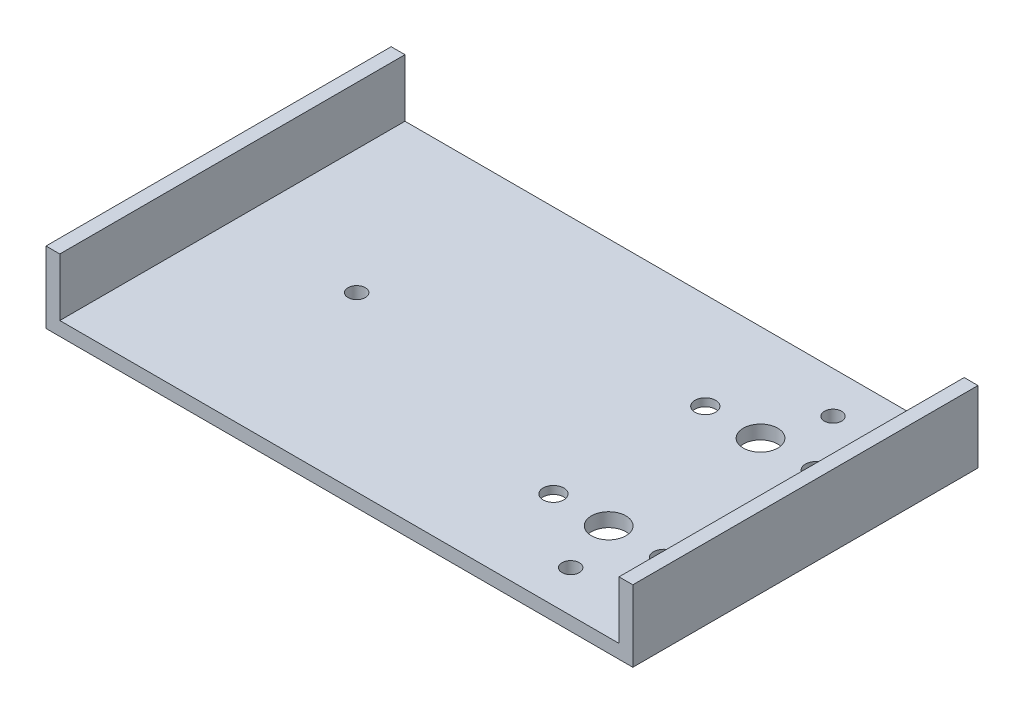
ISO-10303-21;
HEADER;
FILE_DESCRIPTION(('STEP AP214'),'2;1');
FILE_NAME('part.step','',(''),(''),'','','');
FILE_SCHEMA(('AUTOMOTIVE_DESIGN { 1 0 10303 214 1 1 1 1 }'));
ENDSEC;
DATA;
#1=APPLICATION_CONTEXT('core data for automotive mechanical design processes');
#2=APPLICATION_PROTOCOL_DEFINITION('international standard','automotive_design',2000,#1);
#3=PRODUCT_CONTEXT('',#1,'mechanical');
#4=PRODUCT('Part','Part','',(#3));
#5=PRODUCT_RELATED_PRODUCT_CATEGORY('part','',(#4));
#6=PRODUCT_DEFINITION_FORMATION('','',#4);
#7=PRODUCT_DEFINITION_CONTEXT('part definition',#1,'design');
#8=PRODUCT_DEFINITION('design','',#6,#7);
#9=PRODUCT_DEFINITION_SHAPE('','',#8);
#10=(LENGTH_UNIT() NAMED_UNIT(*) SI_UNIT(.MILLI.,.METRE.));
#11=(NAMED_UNIT(*) PLANE_ANGLE_UNIT() SI_UNIT($,.RADIAN.));
#12=(NAMED_UNIT(*) SI_UNIT($,.STERADIAN.) SOLID_ANGLE_UNIT());
#13=UNCERTAINTY_MEASURE_WITH_UNIT(LENGTH_MEASURE(1.E-05),#10,'distance_accuracy_value','');
#14=(GEOMETRIC_REPRESENTATION_CONTEXT(3) GLOBAL_UNCERTAINTY_ASSIGNED_CONTEXT((#13)) GLOBAL_UNIT_ASSIGNED_CONTEXT((#10,
#11,#12)) REPRESENTATION_CONTEXT('',''));
#15=CARTESIAN_POINT('',(0.,0.,0.));
#16=DIRECTION('',(0.,0.,1.));
#17=DIRECTION('',(1.,0.,0.));
#18=AXIS2_PLACEMENT_3D('',#15,#16,#17);
#19=CARTESIAN_POINT('',(0.,0.,100.));
#20=DIRECTION('',(1.,0.,0.));
#21=DIRECTION('',(0.,0.,-1.));
#22=AXIS2_PLACEMENT_3D('',#19,#20,#21);
#23=PLANE('',#22);
#24=DIRECTION('',(0.,-1.,0.));
#25=VECTOR('',#24,1.);
#26=CARTESIAN_POINT('',(0.,0.,0.));
#27=LINE('',#26,#25);
#28=CARTESIAN_POINT('',(0.,20.7,0.));
#29=VERTEX_POINT('',#28);
#30=CARTESIAN_POINT('',(0.,0.,0.));
#31=VERTEX_POINT('',#30);
#32=EDGE_CURVE('E133',#29,#31,#27,.T.);
#33=ORIENTED_EDGE('',*,*,#32,.T.);
#34=DIRECTION('',(0.,0.,-1.));
#35=VECTOR('',#34,1.);
#36=CARTESIAN_POINT('',(0.,0.,100.));
#37=LINE('',#36,#35);
#38=CARTESIAN_POINT('',(0.,0.,100.));
#39=VERTEX_POINT('',#38);
#40=EDGE_CURVE('E161',#39,#31,#37,.T.);
#41=ORIENTED_EDGE('',*,*,#40,.F.);
#42=DIRECTION('',(0.,-1.,0.));
#43=VECTOR('',#42,1.);
#44=CARTESIAN_POINT('',(0.,0.,100.));
#45=LINE('',#44,#43);
#46=CARTESIAN_POINT('',(0.,20.7,100.));
#47=VERTEX_POINT('',#46);
#48=EDGE_CURVE('E148',#47,#39,#45,.T.);
#49=ORIENTED_EDGE('',*,*,#48,.F.);
#50=DIRECTION('',(0.,0.,-1.));
#51=VECTOR('',#50,1.);
#52=CARTESIAN_POINT('',(0.,20.7,100.));
#53=LINE('',#52,#51);
#54=EDGE_CURVE('E129',#47,#29,#53,.T.);
#55=ORIENTED_EDGE('',*,*,#54,.T.);
#56=EDGE_LOOP('',(#33,#41,#49,#55));
#57=FACE_BOUND('',#56,.T.);
#58=ADVANCED_FACE('F35',(#57),#23,.F.);
#59=CARTESIAN_POINT('',(0.,0.,100.));
#60=DIRECTION('',(0.,1.,0.));
#61=DIRECTION('',(0.,0.,1.));
#62=AXIS2_PLACEMENT_3D('',#59,#60,#61);
#63=PLANE('',#62);
#64=CARTESIAN_POINT('',(151.,0.,28.));
#65=DIRECTION('',(0.,1.,0.));
#66=DIRECTION('',(0.,0.,1.));
#67=AXIS2_PLACEMENT_3D('',#64,#65,#66);
#68=CIRCLE('',#67,6.00000000000003);
#69=CARTESIAN_POINT('',(151.,0.,34.));
#70=VERTEX_POINT('',#69);
#71=EDGE_CURVE('E11',#70,#70,#68,.T.);
#72=ORIENTED_EDGE('',*,*,#71,.T.);
#73=EDGE_LOOP('',(#72));
#74=FACE_BOUND('',#73,.T.);
#75=CARTESIAN_POINT('',(119.,0.,28.));
#76=DIRECTION('',(0.,1.,0.));
#77=DIRECTION('',(0.,0.,1.));
#78=AXIS2_PLACEMENT_3D('',#75,#76,#77);
#79=CIRCLE('',#78,6.00000000000003);
#80=CARTESIAN_POINT('',(119.,0.,34.));
#81=VERTEX_POINT('',#80);
#82=EDGE_CURVE('E178',#81,#81,#79,.T.);
#83=ORIENTED_EDGE('',*,*,#82,.T.);
#84=EDGE_LOOP('',(#83));
#85=FACE_BOUND('',#84,.T.);
#86=CARTESIAN_POINT('',(119.,0.,72.));
#87=DIRECTION('',(0.,1.,0.));
#88=DIRECTION('',(0.,0.,1.));
#89=AXIS2_PLACEMENT_3D('',#86,#87,#88);
#90=CIRCLE('',#89,6.00000000000009);
#91=CARTESIAN_POINT('',(119.,0.,65.9999999999999));
#92=VERTEX_POINT('',#91);
#93=EDGE_CURVE('E172',#92,#92,#90,.T.);
#94=ORIENTED_EDGE('',*,*,#93,.T.);
#95=EDGE_LOOP('',(#94));
#96=FACE_BOUND('',#95,.T.);
#97=CARTESIAN_POINT('',(151.,0.,72.));
#98=DIRECTION('',(0.,1.,0.));
#99=DIRECTION('',(0.,0.,1.));
#100=AXIS2_PLACEMENT_3D('',#97,#98,#99);
#101=CIRCLE('',#100,6.00000000000001);
#102=CARTESIAN_POINT('',(151.,0.,78.));
#103=VERTEX_POINT('',#102);
#104=EDGE_CURVE('E166',#103,#103,#101,.T.);
#105=ORIENTED_EDGE('',*,*,#104,.T.);
#106=EDGE_LOOP('',(#105));
#107=FACE_BOUND('',#106,.T.);
#108=CARTESIAN_POINT('',(140.,0.,12.));
#109=DIRECTION('',(0.,-1.,0.));
#110=DIRECTION('',(0.,0.,-1.));
#111=AXIS2_PLACEMENT_3D('',#108,#109,#110);
#112=CIRCLE('',#111,2.5);
#113=CARTESIAN_POINT('',(140.,0.,9.5));
#114=VERTEX_POINT('',#113);
#115=EDGE_CURVE('E240',#114,#114,#112,.T.);
#116=ORIENTED_EDGE('',*,*,#115,.F.);
#117=EDGE_LOOP('',(#116));
#118=FACE_BOUND('',#117,.T.);
#119=CARTESIAN_POINT('',(160.,0.,12.));
#120=DIRECTION('',(0.,-1.,0.));
#121=DIRECTION('',(0.,0.,-1.));
#122=AXIS2_PLACEMENT_3D('',#119,#120,#121);
#123=CIRCLE('',#122,2.5);
#124=CARTESIAN_POINT('',(160.,0.,9.5));
#125=VERTEX_POINT('',#124);
#126=EDGE_CURVE('E244',#125,#125,#123,.T.);
#127=ORIENTED_EDGE('',*,*,#126,.F.);
#128=EDGE_LOOP('',(#127));
#129=FACE_BOUND('',#128,.T.);
#130=CARTESIAN_POINT('',(140.,0.,88.));
#131=DIRECTION('',(0.,-1.,0.));
#132=DIRECTION('',(0.,0.,-1.));
#133=AXIS2_PLACEMENT_3D('',#130,#131,#132);
#134=CIRCLE('',#133,2.5);
#135=CARTESIAN_POINT('',(140.,0.,85.5));
#136=VERTEX_POINT('',#135);
#137=EDGE_CURVE('E250',#136,#136,#134,.T.);
#138=ORIENTED_EDGE('',*,*,#137,.F.);
#139=EDGE_LOOP('',(#138));
#140=FACE_BOUND('',#139,.T.);
#141=CARTESIAN_POINT('',(160.,0.,88.));
#142=DIRECTION('',(0.,-1.,0.));
#143=DIRECTION('',(0.,0.,-1.));
#144=AXIS2_PLACEMENT_3D('',#141,#142,#143);
#145=CIRCLE('',#144,2.5);
#146=CARTESIAN_POINT('',(160.,0.,85.5));
#147=VERTEX_POINT('',#146);
#148=EDGE_CURVE('E256',#147,#147,#145,.T.);
#149=ORIENTED_EDGE('',*,*,#148,.F.);
#150=EDGE_LOOP('',(#149));
#151=FACE_BOUND('',#150,.T.);
#152=CARTESIAN_POINT('',(40.,0.,50.));
#153=DIRECTION('',(0.,-1.,0.));
#154=DIRECTION('',(0.,0.,-1.));
#155=AXIS2_PLACEMENT_3D('',#152,#153,#154);
#156=CIRCLE('',#155,2.5);
#157=CARTESIAN_POINT('',(40.,0.,47.5));
#158=VERTEX_POINT('',#157);
#159=EDGE_CURVE('E262',#158,#158,#156,.T.);
#160=ORIENTED_EDGE('',*,*,#159,.F.);
#161=EDGE_LOOP('',(#160));
#162=FACE_BOUND('',#161,.T.);
#163=CARTESIAN_POINT('',(135.,0.,28.));
#164=DIRECTION('',(0.,-1.,0.));
#165=DIRECTION('',(0.,0.,-1.));
#166=AXIS2_PLACEMENT_3D('',#163,#164,#165);
#167=CIRCLE('',#166,5.00000000000002);
#168=CARTESIAN_POINT('',(135.,0.,23.));
#169=VERTEX_POINT('',#168);
#170=EDGE_CURVE('E268',#169,#169,#167,.T.);
#171=ORIENTED_EDGE('',*,*,#170,.F.);
#172=EDGE_LOOP('',(#171));
#173=FACE_BOUND('',#172,.T.);
#174=CARTESIAN_POINT('',(135.,0.,72.));
#175=DIRECTION('',(0.,-1.,0.));
#176=DIRECTION('',(0.,0.,-1.));
#177=AXIS2_PLACEMENT_3D('',#174,#175,#176);
#178=CIRCLE('',#177,4.99999999999999);
#179=CARTESIAN_POINT('',(135.,0.,67.));
#180=VERTEX_POINT('',#179);
#181=EDGE_CURVE('E274',#180,#180,#178,.T.);
#182=ORIENTED_EDGE('',*,*,#181,.F.);
#183=EDGE_LOOP('',(#182));
#184=FACE_BOUND('',#183,.T.);
#185=DIRECTION('',(1.,0.,0.));
#186=VECTOR('',#185,1.);
#187=CARTESIAN_POINT('',(0.,0.,0.));
#188=LINE('',#187,#186);
#189=CARTESIAN_POINT('',(170.,0.,0.));
#190=VERTEX_POINT('',#189);
#191=EDGE_CURVE('E136',#31,#190,#188,.T.);
#192=ORIENTED_EDGE('',*,*,#191,.T.);
#193=DIRECTION('',(0.,0.,-1.));
#194=VECTOR('',#193,1.);
#195=CARTESIAN_POINT('',(170.,0.,100.));
#196=LINE('',#195,#194);
#197=CARTESIAN_POINT('',(170.,0.,100.));
#198=VERTEX_POINT('',#197);
#199=EDGE_CURVE('E158',#198,#190,#196,.T.);
#200=ORIENTED_EDGE('',*,*,#199,.F.);
#201=DIRECTION('',(1.,0.,0.));
#202=VECTOR('',#201,1.);
#203=CARTESIAN_POINT('',(0.,0.,100.));
#204=LINE('',#203,#202);
#205=EDGE_CURVE('E96',#39,#198,#204,.T.);
#206=ORIENTED_EDGE('',*,*,#205,.F.);
#207=ORIENTED_EDGE('',*,*,#40,.T.);
#208=EDGE_LOOP('',(#192,#200,#206,#207));
#209=FACE_BOUND('',#208,.T.);
#210=ADVANCED_FACE('F196',(#74,#85,#96,#107,#118,#129,#140,#151,#162,#173,#184,#209),#63,.F.);
#211=CARTESIAN_POINT('',(170.,0.,100.));
#212=DIRECTION('',(-1.,0.,0.));
#213=DIRECTION('',(0.,0.,1.));
#214=AXIS2_PLACEMENT_3D('',#211,#212,#213);
#215=PLANE('',#214);
#216=DIRECTION('',(0.,1.,0.));
#217=VECTOR('',#216,1.);
#218=CARTESIAN_POINT('',(170.,0.,0.));
#219=LINE('',#218,#217);
#220=CARTESIAN_POINT('',(170.,20.7,0.));
#221=VERTEX_POINT('',#220);
#222=EDGE_CURVE('E139',#190,#221,#219,.T.);
#223=ORIENTED_EDGE('',*,*,#222,.T.);
#224=DIRECTION('',(0.,0.,-1.));
#225=VECTOR('',#224,1.);
#226=CARTESIAN_POINT('',(170.,20.7,100.));
#227=LINE('',#226,#225);
#228=CARTESIAN_POINT('',(170.,20.7,100.));
#229=VERTEX_POINT('',#228);
#230=EDGE_CURVE('E155',#229,#221,#227,.T.);
#231=ORIENTED_EDGE('',*,*,#230,.F.);
#232=DIRECTION('',(0.,1.,0.));
#233=VECTOR('',#232,1.);
#234=CARTESIAN_POINT('',(170.,0.,100.));
#235=LINE('',#234,#233);
#236=EDGE_CURVE('E283',#198,#229,#235,.T.);
#237=ORIENTED_EDGE('',*,*,#236,.F.);
#238=ORIENTED_EDGE('',*,*,#199,.T.);
#239=EDGE_LOOP('',(#223,#231,#237,#238));
#240=FACE_BOUND('',#239,.T.);
#241=ADVANCED_FACE('F203',(#240),#215,.F.);
#242=CARTESIAN_POINT('',(170.,20.7,100.));
#243=DIRECTION('',(0.,-1.,0.));
#244=DIRECTION('',(0.,0.,-1.));
#245=AXIS2_PLACEMENT_3D('',#242,#243,#244);
#246=PLANE('',#245);
#247=DIRECTION('',(-1.,0.,0.));
#248=VECTOR('',#247,1.);
#249=CARTESIAN_POINT('',(170.,20.7,0.));
#250=LINE('',#249,#248);
#251=CARTESIAN_POINT('',(166.,20.7,0.));
#252=VERTEX_POINT('',#251);
#253=EDGE_CURVE('E141',#221,#252,#250,.T.);
#254=ORIENTED_EDGE('',*,*,#253,.T.);
#255=DIRECTION('',(0.,0.,-1.));
#256=VECTOR('',#255,1.);
#257=CARTESIAN_POINT('',(166.,20.7,100.));
#258=LINE('',#257,#256);
#259=CARTESIAN_POINT('',(166.,20.7,100.));
#260=VERTEX_POINT('',#259);
#261=EDGE_CURVE('E152',#260,#252,#258,.T.);
#262=ORIENTED_EDGE('',*,*,#261,.F.);
#263=DIRECTION('',(-1.,0.,0.));
#264=VECTOR('',#263,1.);
#265=CARTESIAN_POINT('',(170.,20.7,100.));
#266=LINE('',#265,#264);
#267=EDGE_CURVE('E285',#229,#260,#266,.T.);
#268=ORIENTED_EDGE('',*,*,#267,.F.);
#269=ORIENTED_EDGE('',*,*,#230,.T.);
#270=EDGE_LOOP('',(#254,#262,#268,#269));
#271=FACE_BOUND('',#270,.T.);
#272=ADVANCED_FACE('F291',(#271),#246,.F.);
#273=CARTESIAN_POINT('',(166.,4.,100.));
#274=DIRECTION('',(1.,0.,0.));
#275=DIRECTION('',(0.,0.,-1.));
#276=AXIS2_PLACEMENT_3D('',#273,#274,#275);
#277=PLANE('',#276);
#278=DIRECTION('',(0.,-1.,0.));
#279=VECTOR('',#278,1.);
#280=CARTESIAN_POINT('',(166.,4.,0.));
#281=LINE('',#280,#279);
#282=CARTESIAN_POINT('',(166.,4.,0.));
#283=VERTEX_POINT('',#282);
#284=EDGE_CURVE('E143',#252,#283,#281,.T.);
#285=ORIENTED_EDGE('',*,*,#284,.T.);
#286=DIRECTION('',(0.,0.,-1.));
#287=VECTOR('',#286,1.);
#288=CARTESIAN_POINT('',(166.,4.,100.));
#289=LINE('',#288,#287);
#290=CARTESIAN_POINT('',(166.,4.,100.));
#291=VERTEX_POINT('',#290);
#292=EDGE_CURVE('E124',#291,#283,#289,.T.);
#293=ORIENTED_EDGE('',*,*,#292,.F.);
#294=DIRECTION('',(0.,-1.,0.));
#295=VECTOR('',#294,1.);
#296=CARTESIAN_POINT('',(166.,4.,100.));
#297=LINE('',#296,#295);
#298=EDGE_CURVE('E115',#260,#291,#297,.T.);
#299=ORIENTED_EDGE('',*,*,#298,.F.);
#300=ORIENTED_EDGE('',*,*,#261,.T.);
#301=EDGE_LOOP('',(#285,#293,#299,#300));
#302=FACE_BOUND('',#301,.T.);
#303=ADVANCED_FACE('F295',(#302),#277,.F.);
#304=CARTESIAN_POINT('',(4.,4.,100.));
#305=DIRECTION('',(0.,-1.,0.));
#306=DIRECTION('',(0.,0.,-1.));
#307=AXIS2_PLACEMENT_3D('',#304,#305,#306);
#308=PLANE('',#307);
#309=CARTESIAN_POINT('',(119.,4.,72.));
#310=DIRECTION('',(0.,-1.,0.));
#311=DIRECTION('',(0.,0.,-1.));
#312=AXIS2_PLACEMENT_3D('',#309,#310,#311);
#313=CIRCLE('',#312,3.00000000000001);
#314=CARTESIAN_POINT('',(119.,4.,69.));
#315=VERTEX_POINT('',#314);
#316=EDGE_CURVE('E227',#315,#315,#313,.T.);
#317=ORIENTED_EDGE('',*,*,#316,.T.);
#318=EDGE_LOOP('',(#317));
#319=FACE_BOUND('',#318,.T.);
#320=CARTESIAN_POINT('',(151.,4.,72.));
#321=DIRECTION('',(0.,-1.,0.));
#322=DIRECTION('',(0.,0.,-1.));
#323=AXIS2_PLACEMENT_3D('',#320,#321,#322);
#324=CIRCLE('',#323,2.99999999999999);
#325=CARTESIAN_POINT('',(151.,4.,69.));
#326=VERTEX_POINT('',#325);
#327=EDGE_CURVE('E229',#326,#326,#324,.T.);
#328=ORIENTED_EDGE('',*,*,#327,.T.);
#329=EDGE_LOOP('',(#328));
#330=FACE_BOUND('',#329,.T.);
#331=CARTESIAN_POINT('',(119.,4.,28.));
#332=DIRECTION('',(0.,-1.,0.));
#333=DIRECTION('',(0.,0.,-1.));
#334=AXIS2_PLACEMENT_3D('',#331,#332,#333);
#335=CIRCLE('',#334,3.00000000000001);
#336=CARTESIAN_POINT('',(119.,4.,25.));
#337=VERTEX_POINT('',#336);
#338=EDGE_CURVE('E232',#337,#337,#335,.T.);
#339=ORIENTED_EDGE('',*,*,#338,.T.);
#340=EDGE_LOOP('',(#339));
#341=FACE_BOUND('',#340,.T.);
#342=CARTESIAN_POINT('',(151.,4.,28.));
#343=DIRECTION('',(0.,-1.,0.));
#344=DIRECTION('',(0.,0.,-1.));
#345=AXIS2_PLACEMENT_3D('',#342,#343,#344);
#346=CIRCLE('',#345,2.99999999999999);
#347=CARTESIAN_POINT('',(151.,4.,25.));
#348=VERTEX_POINT('',#347);
#349=EDGE_CURVE('E237',#348,#348,#346,.T.);
#350=ORIENTED_EDGE('',*,*,#349,.T.);
#351=EDGE_LOOP('',(#350));
#352=FACE_BOUND('',#351,.T.);
#353=CARTESIAN_POINT('',(140.,4.,12.));
#354=DIRECTION('',(0.,-1.,0.));
#355=DIRECTION('',(0.,0.,-1.));
#356=AXIS2_PLACEMENT_3D('',#353,#354,#355);
#357=CIRCLE('',#356,2.5);
#358=CARTESIAN_POINT('',(140.,4.,9.5));
#359=VERTEX_POINT('',#358);
#360=EDGE_CURVE('E241',#359,#359,#357,.T.);
#361=ORIENTED_EDGE('',*,*,#360,.T.);
#362=EDGE_LOOP('',(#361));
#363=FACE_BOUND('',#362,.T.);
#364=CARTESIAN_POINT('',(160.,4.,12.));
#365=DIRECTION('',(0.,-1.,0.));
#366=DIRECTION('',(0.,0.,-1.));
#367=AXIS2_PLACEMENT_3D('',#364,#365,#366);
#368=CIRCLE('',#367,2.5);
#369=CARTESIAN_POINT('',(160.,4.,9.5));
#370=VERTEX_POINT('',#369);
#371=EDGE_CURVE('E247',#370,#370,#368,.T.);
#372=ORIENTED_EDGE('',*,*,#371,.T.);
#373=EDGE_LOOP('',(#372));
#374=FACE_BOUND('',#373,.T.);
#375=CARTESIAN_POINT('',(140.,4.,88.));
#376=DIRECTION('',(0.,-1.,0.));
#377=DIRECTION('',(0.,0.,-1.));
#378=AXIS2_PLACEMENT_3D('',#375,#376,#377);
#379=CIRCLE('',#378,2.5);
#380=CARTESIAN_POINT('',(140.,4.,85.5));
#381=VERTEX_POINT('',#380);
#382=EDGE_CURVE('E253',#381,#381,#379,.T.);
#383=ORIENTED_EDGE('',*,*,#382,.T.);
#384=EDGE_LOOP('',(#383));
#385=FACE_BOUND('',#384,.T.);
#386=CARTESIAN_POINT('',(160.,4.,88.));
#387=DIRECTION('',(0.,-1.,0.));
#388=DIRECTION('',(0.,0.,-1.));
#389=AXIS2_PLACEMENT_3D('',#386,#387,#388);
#390=CIRCLE('',#389,2.5);
#391=CARTESIAN_POINT('',(160.,4.,85.5));
#392=VERTEX_POINT('',#391);
#393=EDGE_CURVE('E259',#392,#392,#390,.T.);
#394=ORIENTED_EDGE('',*,*,#393,.T.);
#395=EDGE_LOOP('',(#394));
#396=FACE_BOUND('',#395,.T.);
#397=CARTESIAN_POINT('',(40.,4.,50.));
#398=DIRECTION('',(0.,-1.,0.));
#399=DIRECTION('',(0.,0.,-1.));
#400=AXIS2_PLACEMENT_3D('',#397,#398,#399);
#401=CIRCLE('',#400,2.5);
#402=CARTESIAN_POINT('',(40.,4.,47.5));
#403=VERTEX_POINT('',#402);
#404=EDGE_CURVE('E265',#403,#403,#401,.T.);
#405=ORIENTED_EDGE('',*,*,#404,.T.);
#406=EDGE_LOOP('',(#405));
#407=FACE_BOUND('',#406,.T.);
#408=CARTESIAN_POINT('',(135.,4.,28.));
#409=DIRECTION('',(0.,-1.,0.));
#410=DIRECTION('',(0.,0.,-1.));
#411=AXIS2_PLACEMENT_3D('',#408,#409,#410);
#412=CIRCLE('',#411,5.00000000000002);
#413=CARTESIAN_POINT('',(135.,4.,23.));
#414=VERTEX_POINT('',#413);
#415=EDGE_CURVE('E271',#414,#414,#412,.T.);
#416=ORIENTED_EDGE('',*,*,#415,.T.);
#417=EDGE_LOOP('',(#416));
#418=FACE_BOUND('',#417,.T.);
#419=CARTESIAN_POINT('',(135.,4.,72.));
#420=DIRECTION('',(0.,-1.,0.));
#421=DIRECTION('',(0.,0.,-1.));
#422=AXIS2_PLACEMENT_3D('',#419,#420,#421);
#423=CIRCLE('',#422,4.99999999999999);
#424=CARTESIAN_POINT('',(135.,4.,67.));
#425=VERTEX_POINT('',#424);
#426=EDGE_CURVE('E137',#425,#425,#423,.T.);
#427=ORIENTED_EDGE('',*,*,#426,.T.);
#428=EDGE_LOOP('',(#427));
#429=FACE_BOUND('',#428,.T.);
#430=DIRECTION('',(-1.,0.,0.));
#431=VECTOR('',#430,1.);
#432=CARTESIAN_POINT('',(4.,4.,0.));
#433=LINE('',#432,#431);
#434=CARTESIAN_POINT('',(4.,4.,0.));
#435=VERTEX_POINT('',#434);
#436=EDGE_CURVE('E123',#283,#435,#433,.T.);
#437=ORIENTED_EDGE('',*,*,#436,.T.);
#438=DIRECTION('',(0.,0.,-1.));
#439=VECTOR('',#438,1.);
#440=CARTESIAN_POINT('',(4.,4.,100.));
#441=LINE('',#440,#439);
#442=CARTESIAN_POINT('',(4.,4.,100.));
#443=VERTEX_POINT('',#442);
#444=EDGE_CURVE('E120',#443,#435,#441,.T.);
#445=ORIENTED_EDGE('',*,*,#444,.F.);
#446=DIRECTION('',(-1.,0.,0.));
#447=VECTOR('',#446,1.);
#448=CARTESIAN_POINT('',(4.,4.,100.));
#449=LINE('',#448,#447);
#450=EDGE_CURVE('E109',#291,#443,#449,.T.);
#451=ORIENTED_EDGE('',*,*,#450,.F.);
#452=ORIENTED_EDGE('',*,*,#292,.T.);
#453=EDGE_LOOP('',(#437,#445,#451,#452));
#454=FACE_BOUND('',#453,.T.);
#455=ADVANCED_FACE('F121',(#319,#330,#341,#352,#363,#374,#385,#396,#407,#418,#429,#454),#308,.F.);
#456=CARTESIAN_POINT('',(4.,4.,100.));
#457=DIRECTION('',(-1.,0.,0.));
#458=DIRECTION('',(0.,0.,1.));
#459=AXIS2_PLACEMENT_3D('',#456,#457,#458);
#460=PLANE('',#459);
#461=DIRECTION('',(0.,1.,0.));
#462=VECTOR('',#461,1.);
#463=CARTESIAN_POINT('',(4.,4.,0.));
#464=LINE('',#463,#462);
#465=CARTESIAN_POINT('',(4.,20.7,0.));
#466=VERTEX_POINT('',#465);
#467=EDGE_CURVE('E81',#435,#466,#464,.T.);
#468=ORIENTED_EDGE('',*,*,#467,.T.);
#469=DIRECTION('',(0.,0.,-1.));
#470=VECTOR('',#469,1.);
#471=CARTESIAN_POINT('',(4.,20.7,100.));
#472=LINE('',#471,#470);
#473=CARTESIAN_POINT('',(4.,20.7,100.));
#474=VERTEX_POINT('',#473);
#475=EDGE_CURVE('E125',#474,#466,#472,.T.);
#476=ORIENTED_EDGE('',*,*,#475,.F.);
#477=DIRECTION('',(0.,1.,0.));
#478=VECTOR('',#477,1.);
#479=CARTESIAN_POINT('',(4.,4.,100.));
#480=LINE('',#479,#478);
#481=EDGE_CURVE('E113',#443,#474,#480,.T.);
#482=ORIENTED_EDGE('',*,*,#481,.F.);
#483=ORIENTED_EDGE('',*,*,#444,.T.);
#484=EDGE_LOOP('',(#468,#476,#482,#483));
#485=FACE_BOUND('',#484,.T.);
#486=ADVANCED_FACE('F127',(#485),#460,.F.);
#487=CARTESIAN_POINT('',(0.,20.7,100.));
#488=DIRECTION('',(0.,-1.,0.));
#489=DIRECTION('',(0.,0.,-1.));
#490=AXIS2_PLACEMENT_3D('',#487,#488,#489);
#491=PLANE('',#490);
#492=DIRECTION('',(-1.,0.,0.));
#493=VECTOR('',#492,1.);
#494=CARTESIAN_POINT('',(0.,20.7,0.));
#495=LINE('',#494,#493);
#496=EDGE_CURVE('E87',#466,#29,#495,.T.);
#497=ORIENTED_EDGE('',*,*,#496,.T.);
#498=ORIENTED_EDGE('',*,*,#54,.F.);
#499=DIRECTION('',(-1.,0.,0.));
#500=VECTOR('',#499,1.);
#501=CARTESIAN_POINT('',(0.,20.7,100.));
#502=LINE('',#501,#500);
#503=EDGE_CURVE('E52',#474,#47,#502,.T.);
#504=ORIENTED_EDGE('',*,*,#503,.F.);
#505=ORIENTED_EDGE('',*,*,#475,.T.);
#506=EDGE_LOOP('',(#497,#498,#504,#505));
#507=FACE_BOUND('',#506,.T.);
#508=ADVANCED_FACE('F302',(#507),#491,.F.);
#509=CARTESIAN_POINT('',(0.,0.,100.));
#510=DIRECTION('',(0.,0.,-1.));
#511=DIRECTION('',(-1.,0.,0.));
#512=AXIS2_PLACEMENT_3D('',#509,#510,#511);
#513=PLANE('',#512);
#514=ORIENTED_EDGE('',*,*,#48,.T.);
#515=ORIENTED_EDGE('',*,*,#205,.T.);
#516=ORIENTED_EDGE('',*,*,#236,.T.);
#517=ORIENTED_EDGE('',*,*,#267,.T.);
#518=ORIENTED_EDGE('',*,*,#298,.T.);
#519=ORIENTED_EDGE('',*,*,#450,.T.);
#520=ORIENTED_EDGE('',*,*,#481,.T.);
#521=ORIENTED_EDGE('',*,*,#503,.T.);
#522=EDGE_LOOP('',(#514,#515,#516,#517,#518,#519,#520,#521));
#523=FACE_BOUND('',#522,.T.);
#524=ADVANCED_FACE('F111',(#523),#513,.F.);
#525=CARTESIAN_POINT('',(0.,0.,0.));
#526=DIRECTION('',(0.,0.,-1.));
#527=DIRECTION('',(-1.,0.,0.));
#528=AXIS2_PLACEMENT_3D('',#525,#526,#527);
#529=PLANE('',#528);
#530=ORIENTED_EDGE('',*,*,#32,.F.);
#531=ORIENTED_EDGE('',*,*,#496,.F.);
#532=ORIENTED_EDGE('',*,*,#467,.F.);
#533=ORIENTED_EDGE('',*,*,#436,.F.);
#534=ORIENTED_EDGE('',*,*,#284,.F.);
#535=ORIENTED_EDGE('',*,*,#253,.F.);
#536=ORIENTED_EDGE('',*,*,#222,.F.);
#537=ORIENTED_EDGE('',*,*,#191,.F.);
#538=EDGE_LOOP('',(#530,#531,#532,#533,#534,#535,#536,#537));
#539=FACE_BOUND('',#538,.T.);
#540=ADVANCED_FACE('F298',(#539),#529,.T.);
#541=CARTESIAN_POINT('',(135.,4.,72.));
#542=DIRECTION('',(0.,-1.,0.));
#543=DIRECTION('',(0.,0.,-1.));
#544=AXIS2_PLACEMENT_3D('',#541,#542,#543);
#545=CYLINDRICAL_SURFACE('',#544,4.99999999999999);
#546=ORIENTED_EDGE('',*,*,#426,.F.);
#547=EDGE_LOOP('',(#546));
#548=FACE_BOUND('',#547,.T.);
#549=ORIENTED_EDGE('',*,*,#181,.T.);
#550=EDGE_LOOP('',(#549));
#551=FACE_BOUND('',#550,.T.);
#552=ADVANCED_FACE('F361',(#548,#551),#545,.F.);
#553=CARTESIAN_POINT('',(135.,4.,28.));
#554=DIRECTION('',(0.,-1.,0.));
#555=DIRECTION('',(0.,0.,-1.));
#556=AXIS2_PLACEMENT_3D('',#553,#554,#555);
#557=CYLINDRICAL_SURFACE('',#556,5.00000000000002);
#558=ORIENTED_EDGE('',*,*,#415,.F.);
#559=EDGE_LOOP('',(#558));
#560=FACE_BOUND('',#559,.T.);
#561=ORIENTED_EDGE('',*,*,#170,.T.);
#562=EDGE_LOOP('',(#561));
#563=FACE_BOUND('',#562,.T.);
#564=ADVANCED_FACE('F369',(#560,#563),#557,.F.);
#565=CARTESIAN_POINT('',(40.,4.,50.));
#566=DIRECTION('',(0.,-1.,0.));
#567=DIRECTION('',(0.,0.,-1.));
#568=AXIS2_PLACEMENT_3D('',#565,#566,#567);
#569=CYLINDRICAL_SURFACE('',#568,2.5);
#570=ORIENTED_EDGE('',*,*,#404,.F.);
#571=EDGE_LOOP('',(#570));
#572=FACE_BOUND('',#571,.T.);
#573=ORIENTED_EDGE('',*,*,#159,.T.);
#574=EDGE_LOOP('',(#573));
#575=FACE_BOUND('',#574,.T.);
#576=ADVANCED_FACE('F376',(#572,#575),#569,.F.);
#577=CARTESIAN_POINT('',(160.,4.,88.));
#578=DIRECTION('',(0.,-1.,0.));
#579=DIRECTION('',(0.,0.,-1.));
#580=AXIS2_PLACEMENT_3D('',#577,#578,#579);
#581=CYLINDRICAL_SURFACE('',#580,2.5);
#582=ORIENTED_EDGE('',*,*,#393,.F.);
#583=EDGE_LOOP('',(#582));
#584=FACE_BOUND('',#583,.T.);
#585=ORIENTED_EDGE('',*,*,#148,.T.);
#586=EDGE_LOOP('',(#585));
#587=FACE_BOUND('',#586,.T.);
#588=ADVANCED_FACE('F384',(#584,#587),#581,.F.);
#589=CARTESIAN_POINT('',(140.,4.,88.));
#590=DIRECTION('',(0.,-1.,0.));
#591=DIRECTION('',(0.,0.,-1.));
#592=AXIS2_PLACEMENT_3D('',#589,#590,#591);
#593=CYLINDRICAL_SURFACE('',#592,2.5);
#594=ORIENTED_EDGE('',*,*,#382,.F.);
#595=EDGE_LOOP('',(#594));
#596=FACE_BOUND('',#595,.T.);
#597=ORIENTED_EDGE('',*,*,#137,.T.);
#598=EDGE_LOOP('',(#597));
#599=FACE_BOUND('',#598,.T.);
#600=ADVANCED_FACE('F392',(#596,#599),#593,.F.);
#601=CARTESIAN_POINT('',(160.,4.,12.));
#602=DIRECTION('',(0.,-1.,0.));
#603=DIRECTION('',(0.,0.,-1.));
#604=AXIS2_PLACEMENT_3D('',#601,#602,#603);
#605=CYLINDRICAL_SURFACE('',#604,2.5);
#606=ORIENTED_EDGE('',*,*,#371,.F.);
#607=EDGE_LOOP('',(#606));
#608=FACE_BOUND('',#607,.T.);
#609=ORIENTED_EDGE('',*,*,#126,.T.);
#610=EDGE_LOOP('',(#609));
#611=FACE_BOUND('',#610,.T.);
#612=ADVANCED_FACE('F400',(#608,#611),#605,.F.);
#613=CARTESIAN_POINT('',(140.,4.,12.));
#614=DIRECTION('',(0.,-1.,0.));
#615=DIRECTION('',(0.,0.,-1.));
#616=AXIS2_PLACEMENT_3D('',#613,#614,#615);
#617=CYLINDRICAL_SURFACE('',#616,2.5);
#618=ORIENTED_EDGE('',*,*,#360,.F.);
#619=EDGE_LOOP('',(#618));
#620=FACE_BOUND('',#619,.T.);
#621=ORIENTED_EDGE('',*,*,#115,.T.);
#622=EDGE_LOOP('',(#621));
#623=FACE_BOUND('',#622,.T.);
#624=ADVANCED_FACE('F408',(#620,#623),#617,.F.);
#625=CARTESIAN_POINT('',(151.,4.,28.));
#626=DIRECTION('',(0.,-1.,0.));
#627=DIRECTION('',(0.,0.,-1.));
#628=AXIS2_PLACEMENT_3D('',#625,#626,#627);
#629=CYLINDRICAL_SURFACE('',#628,2.99999999999999);
#630=CARTESIAN_POINT('',(151.,1.73205080756889,28.));
#631=DIRECTION('',(0.,1.,0.));
#632=DIRECTION('',(0.,0.,1.));
#633=AXIS2_PLACEMENT_3D('',#630,#631,#632);
#634=CIRCLE('',#633,2.99999999999999);
#635=CARTESIAN_POINT('',(151.,1.73205080756889,31.));
#636=VERTEX_POINT('',#635);
#637=EDGE_CURVE('E44',#636,#636,#634,.F.);
#638=ORIENTED_EDGE('',*,*,#637,.T.);
#639=EDGE_LOOP('',(#638));
#640=FACE_BOUND('',#639,.T.);
#641=ORIENTED_EDGE('',*,*,#349,.F.);
#642=EDGE_LOOP('',(#641));
#643=FACE_BOUND('',#642,.T.);
#644=ADVANCED_FACE('F183',(#640,#643),#629,.F.);
#645=CARTESIAN_POINT('',(119.,4.,28.));
#646=DIRECTION('',(0.,-1.,0.));
#647=DIRECTION('',(0.,0.,-1.));
#648=AXIS2_PLACEMENT_3D('',#645,#646,#647);
#649=CYLINDRICAL_SURFACE('',#648,3.00000000000001);
#650=CARTESIAN_POINT('',(119.,1.73205080756888,28.));
#651=DIRECTION('',(0.,1.,0.));
#652=DIRECTION('',(0.,0.,1.));
#653=AXIS2_PLACEMENT_3D('',#650,#651,#652);
#654=CIRCLE('',#653,3.00000000000001);
#655=CARTESIAN_POINT('',(119.,1.73205080756888,31.));
#656=VERTEX_POINT('',#655);
#657=EDGE_CURVE('E175',#656,#656,#654,.F.);
#658=ORIENTED_EDGE('',*,*,#657,.T.);
#659=EDGE_LOOP('',(#658));
#660=FACE_BOUND('',#659,.T.);
#661=ORIENTED_EDGE('',*,*,#338,.F.);
#662=EDGE_LOOP('',(#661));
#663=FACE_BOUND('',#662,.T.);
#664=ADVANCED_FACE('F424',(#660,#663),#649,.F.);
#665=CARTESIAN_POINT('',(151.,4.,72.));
#666=DIRECTION('',(0.,-1.,0.));
#667=DIRECTION('',(0.,0.,-1.));
#668=AXIS2_PLACEMENT_3D('',#665,#666,#667);
#669=CYLINDRICAL_SURFACE('',#668,2.99999999999999);
#670=CARTESIAN_POINT('',(151.,1.73205080756888,72.));
#671=DIRECTION('',(0.,1.,0.));
#672=DIRECTION('',(0.,0.,1.));
#673=AXIS2_PLACEMENT_3D('',#670,#671,#672);
#674=CIRCLE('',#673,2.99999999999999);
#675=CARTESIAN_POINT('',(151.,1.73205080756888,75.));
#676=VERTEX_POINT('',#675);
#677=EDGE_CURVE('E163',#676,#676,#674,.F.);
#678=ORIENTED_EDGE('',*,*,#677,.T.);
#679=EDGE_LOOP('',(#678));
#680=FACE_BOUND('',#679,.T.);
#681=ORIENTED_EDGE('',*,*,#327,.F.);
#682=EDGE_LOOP('',(#681));
#683=FACE_BOUND('',#682,.T.);
#684=ADVANCED_FACE('F223',(#680,#683),#669,.F.);
#685=CARTESIAN_POINT('',(119.,4.,72.));
#686=DIRECTION('',(0.,-1.,0.));
#687=DIRECTION('',(0.,0.,-1.));
#688=AXIS2_PLACEMENT_3D('',#685,#686,#687);
#689=CYLINDRICAL_SURFACE('',#688,3.00000000000001);
#690=CARTESIAN_POINT('',(119.,1.73205080756891,72.));
#691=DIRECTION('',(0.,1.,0.));
#692=DIRECTION('',(0.,0.,1.));
#693=AXIS2_PLACEMENT_3D('',#690,#691,#692);
#694=CIRCLE('',#693,3.00000000000001);
#695=CARTESIAN_POINT('',(119.,1.73205080756891,69.));
#696=VERTEX_POINT('',#695);
#697=EDGE_CURVE('E169',#696,#696,#694,.F.);
#698=ORIENTED_EDGE('',*,*,#697,.T.);
#699=EDGE_LOOP('',(#698));
#700=FACE_BOUND('',#699,.T.);
#701=ORIENTED_EDGE('',*,*,#316,.F.);
#702=EDGE_LOOP('',(#701));
#703=FACE_BOUND('',#702,.T.);
#704=ADVANCED_FACE('F211',(#700,#703),#689,.F.);
#705=CARTESIAN_POINT('',(151.,1.73205080756888,72.));
#706=DIRECTION('',(0.,-1.,0.));
#707=DIRECTION('',(0.,0.,-1.));
#708=AXIS2_PLACEMENT_3D('',#705,#706,#707);
#709=CONICAL_SURFACE('',#708,2.99999999999999,1.0471975511966);
#710=ORIENTED_EDGE('',*,*,#104,.F.);
#711=EDGE_LOOP('',(#710));
#712=FACE_BOUND('',#711,.T.);
#713=ORIENTED_EDGE('',*,*,#677,.F.);
#714=EDGE_LOOP('',(#713));
#715=FACE_BOUND('',#714,.T.);
#716=ADVANCED_FACE('F208',(#712,#715),#709,.F.);
#717=CARTESIAN_POINT('',(119.,1.73205080756891,72.));
#718=DIRECTION('',(0.,-1.,0.));
#719=DIRECTION('',(0.,0.,-1.));
#720=AXIS2_PLACEMENT_3D('',#717,#718,#719);
#721=CONICAL_SURFACE('',#720,3.00000000000001,1.0471975511966);
#722=CARTESIAN_POINT('',(119.,0.,65.9999999999999));
#723=CARTESIAN_POINT('',(119.,0.0180421959121759,66.0312499999999));
#724=CARTESIAN_POINT('',(119.,0.0360843918243521,66.0624999999999));
#725=CARTESIAN_POINT('',(119.,0.0721687836487045,66.1249999999999));
#726=CARTESIAN_POINT('',(119.,0.0902109795608807,66.1562499999999));
#727=CARTESIAN_POINT('',(119.,0.126295371385233,66.2187499999999));
#728=CARTESIAN_POINT('',(119.,0.144337567297409,66.2499999999999));
#729=CARTESIAN_POINT('',(119.,0.180421959121762,66.3124999999999));
#730=CARTESIAN_POINT('',(119.,0.198464155033938,66.34375));
#731=CARTESIAN_POINT('',(119.,0.23454854685829,66.4062499999999));
#732=CARTESIAN_POINT('',(119.,0.252590742770465,66.4375));
#733=CARTESIAN_POINT('',(119.,0.288675134594818,66.4999999999999));
#734=CARTESIAN_POINT('',(119.,0.306717330506996,66.5312499999999));
#735=CARTESIAN_POINT('',(119.,0.342801722331348,66.5937499999999));
#736=CARTESIAN_POINT('',(119.,0.360843918243524,66.6249999999999));
#737=CARTESIAN_POINT('',(119.,0.396928310067875,66.6874999999999));
#738=CARTESIAN_POINT('',(119.,0.414970505980052,66.71875));
#739=CARTESIAN_POINT('',(119.,0.451054897804404,66.7812499999999));
#740=CARTESIAN_POINT('',(119.,0.46909709371658,66.8125));
#741=CARTESIAN_POINT('',(119.,0.505181485540933,66.8749999999999));
#742=CARTESIAN_POINT('',(119.,0.523223681453109,66.90625));
#743=CARTESIAN_POINT('',(119.,0.559308073277461,66.96875));
#744=CARTESIAN_POINT('',(119.,0.577350269189637,67.));
#745=CARTESIAN_POINT('',(119.,0.61343466101399,67.0625));
#746=CARTESIAN_POINT('',(119.,0.631476856926166,67.09375));
#747=CARTESIAN_POINT('',(119.,0.667561248750518,67.15625));
#748=CARTESIAN_POINT('',(119.,0.685603444662695,67.1875));
#749=CARTESIAN_POINT('',(119.,0.721687836487047,67.25));
#750=CARTESIAN_POINT('',(119.,0.739730032399223,67.28125));
#751=CARTESIAN_POINT('',(119.,0.775814424223575,67.34375));
#752=CARTESIAN_POINT('',(119.,0.793856620135751,67.375));
#753=CARTESIAN_POINT('',(119.,0.829941011960104,67.4375));
#754=CARTESIAN_POINT('',(119.,0.84798320787228,67.46875));
#755=CARTESIAN_POINT('',(119.,0.884067599696632,67.53125));
#756=CARTESIAN_POINT('',(119.,0.902109795608808,67.5625));
#757=CARTESIAN_POINT('',(119.,0.938194187433161,67.625));
#758=CARTESIAN_POINT('',(119.,0.956236383345337,67.65625));
#759=CARTESIAN_POINT('',(119.,0.992320775169689,67.71875));
#760=CARTESIAN_POINT('',(119.,1.01036297108187,67.75));
#761=CARTESIAN_POINT('',(119.,1.04644736290622,67.8125));
#762=CARTESIAN_POINT('',(119.,1.06448955881839,67.84375));
#763=CARTESIAN_POINT('',(119.,1.10057395064275,67.90625));
#764=CARTESIAN_POINT('',(119.,1.11861614655492,67.9375));
#765=CARTESIAN_POINT('',(119.,1.15470053837928,68.));
#766=CARTESIAN_POINT('',(119.,1.17274273429145,68.03125));
#767=CARTESIAN_POINT('',(119.,1.2088271261158,68.09375));
#768=CARTESIAN_POINT('',(119.,1.22686932202798,68.125));
#769=CARTESIAN_POINT('',(119.,1.26295371385233,68.1875));
#770=CARTESIAN_POINT('',(119.,1.28099590976451,68.21875));
#771=CARTESIAN_POINT('',(119.,1.31708030158886,68.28125));
#772=CARTESIAN_POINT('',(119.,1.33512249750104,68.3125));
#773=CARTESIAN_POINT('',(119.,1.37120688932539,68.375));
#774=CARTESIAN_POINT('',(119.,1.38924908523757,68.40625));
#775=CARTESIAN_POINT('',(119.,1.42533347706192,68.46875));
#776=CARTESIAN_POINT('',(119.,1.44337567297409,68.5));
#777=CARTESIAN_POINT('',(119.,1.47946006479845,68.5625));
#778=CARTESIAN_POINT('',(119.,1.49750226071062,68.59375));
#779=CARTESIAN_POINT('',(119.,1.53358665253497,68.65625));
#780=CARTESIAN_POINT('',(119.,1.55162884844715,68.6875));
#781=CARTESIAN_POINT('',(119.,1.5877132402715,68.75));
#782=CARTESIAN_POINT('',(119.,1.60575543618368,68.78125));
#783=CARTESIAN_POINT('',(119.,1.64183982800803,68.84375));
#784=CARTESIAN_POINT('',(119.,1.65988202392021,68.875));
#785=CARTESIAN_POINT('',(119.,1.69596641574456,68.9375));
#786=CARTESIAN_POINT('',(119.,1.71400861165674,68.96875));
#787=CARTESIAN_POINT('',(119.,1.73205080756891,69.));
#788=B_SPLINE_CURVE_WITH_KNOTS('',3,(#722,#723,#724,#725,#726,#727,#728,#729,#730,#731,#732,
#733,#734,#735,#736,#737,#738,#739,#740,#741,#742,#743,#744,#745,#746,#747,#748,#749,#750,#751,
#752,#753,#754,#755,#756,#757,#758,#759,#760,#761,#762,#763,#764,#765,#766,#767,#768,#769,#770,
#771,#772,#773,#774,#775,#776,#777,#778,#779,#780,#781,#782,#783,#784,#785,#786,#787),
.UNSPECIFIED.,.F.,.F.,(4,2,2,2,2,2,2,2,2,2,2,2,2,2,2,2,2,2,2,2,2,2,2,2,2,2,2,2,2,2,2,2,4),(0.,
0.108253175473058,0.216506350946117,0.324759526419175,0.433012701892234,0.541265877365292,
0.649519052838339,0.757772228311397,0.866025403784456,0.974278579257514,1.08253175473057,
1.19078493020363,1.29903810567669,1.40729128114975,1.51554445662281,1.62379763209586,
1.73205080756892,1.84030398304198,1.94855715851504,2.0568103339881,2.16506350946116,
2.2733166849342,2.38156986040726,2.48982303588032,2.59807621135338,2.70632938682644,
2.8145825622995,2.92283573777255,3.03108891324561,3.13934208871867,3.24759526419173,
3.35584843966479,3.46410161513785),.UNSPECIFIED.);
#789=EDGE_CURVE('BSEAM192',#92,#696,#788,.T.);
#790=ORIENTED_EDGE('',*,*,#93,.F.);
#791=ORIENTED_EDGE('',*,*,#697,.F.);
#792=ORIENTED_EDGE('',*,*,#789,.T.);
#793=ORIENTED_EDGE('',*,*,#789,.F.);
#794=EDGE_LOOP('',(#790,#792,#791,#793));
#795=FACE_BOUND('',#794,.T.);
#796=ADVANCED_FACE('F192',(#795),#721,.F.);
#797=CARTESIAN_POINT('',(119.,1.73205080756888,28.));
#798=DIRECTION('',(0.,-1.,0.));
#799=DIRECTION('',(0.,0.,-1.));
#800=AXIS2_PLACEMENT_3D('',#797,#798,#799);
#801=CONICAL_SURFACE('',#800,3.00000000000001,1.0471975511966);
#802=ORIENTED_EDGE('',*,*,#82,.F.);
#803=EDGE_LOOP('',(#802));
#804=FACE_BOUND('',#803,.T.);
#805=ORIENTED_EDGE('',*,*,#657,.F.);
#806=EDGE_LOOP('',(#805));
#807=FACE_BOUND('',#806,.T.);
#808=ADVANCED_FACE('F187',(#804,#807),#801,.F.);
#809=CARTESIAN_POINT('',(151.,1.73205080756889,28.));
#810=DIRECTION('',(0.,-1.,0.));
#811=DIRECTION('',(0.,0.,-1.));
#812=AXIS2_PLACEMENT_3D('',#809,#810,#811);
#813=CONICAL_SURFACE('',#812,2.99999999999999,1.0471975511966);
#814=ORIENTED_EDGE('',*,*,#71,.F.);
#815=EDGE_LOOP('',(#814));
#816=FACE_BOUND('',#815,.T.);
#817=ORIENTED_EDGE('',*,*,#637,.F.);
#818=EDGE_LOOP('',(#817));
#819=FACE_BOUND('',#818,.T.);
#820=ADVANCED_FACE('F37',(#816,#819),#813,.F.);
#821=CLOSED_SHELL('',(#58,#210,#241,#272,#303,#455,#486,#508,#524,#540,#552,#564,#576,#588,#600,
#612,#624,#644,#664,#684,#704,#716,#796,#808,#820));
#822=MANIFOLD_SOLID_BREP('B2',#821);
#823=ADVANCED_BREP_SHAPE_REPRESENTATION('',(#18,#822),#14);
#824=SHAPE_DEFINITION_REPRESENTATION(#9,#823);
ENDSEC;
END-ISO-10303-21;
